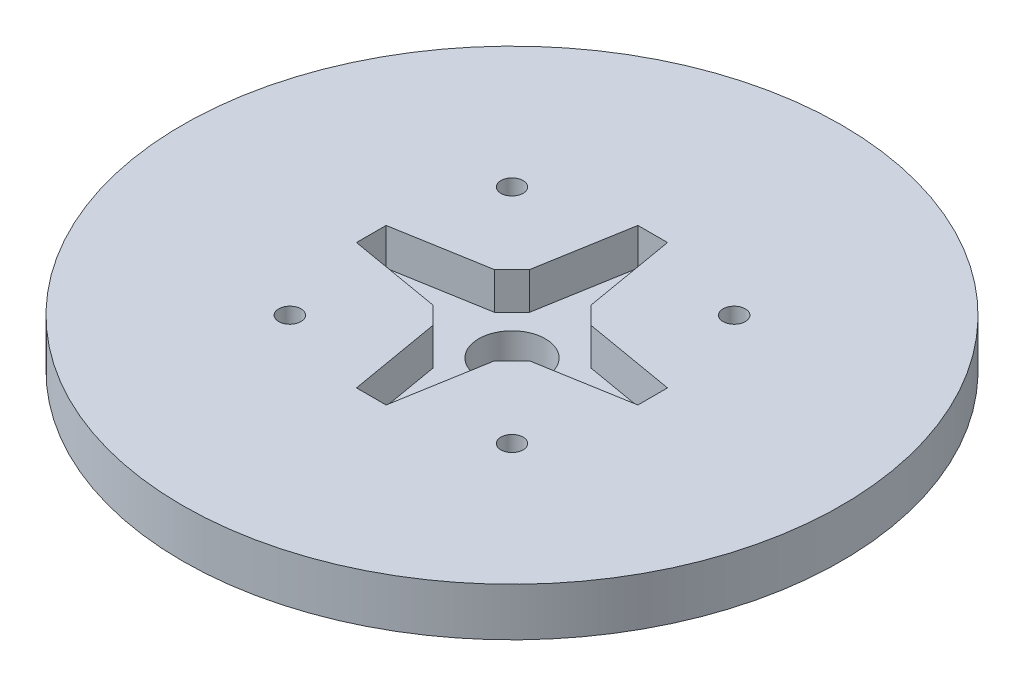
ISO-10303-21;
HEADER;
FILE_DESCRIPTION(('STEP AP214'),'2;1');
FILE_NAME('part.step','',(''),(''),'','','');
FILE_SCHEMA(('AUTOMOTIVE_DESIGN { 1 0 10303 214 1 1 1 1 }'));
ENDSEC;
DATA;
#1=APPLICATION_CONTEXT('core data for automotive mechanical design processes');
#2=APPLICATION_PROTOCOL_DEFINITION('international standard','automotive_design',2000,#1);
#3=PRODUCT_CONTEXT('',#1,'mechanical');
#4=PRODUCT('Part','Part','',(#3));
#5=PRODUCT_RELATED_PRODUCT_CATEGORY('part','',(#4));
#6=PRODUCT_DEFINITION_FORMATION('','',#4);
#7=PRODUCT_DEFINITION_CONTEXT('part definition',#1,'design');
#8=PRODUCT_DEFINITION('design','',#6,#7);
#9=PRODUCT_DEFINITION_SHAPE('','',#8);
#10=(LENGTH_UNIT() NAMED_UNIT(*) SI_UNIT(.MILLI.,.METRE.));
#11=(NAMED_UNIT(*) PLANE_ANGLE_UNIT() SI_UNIT($,.RADIAN.));
#12=(NAMED_UNIT(*) SI_UNIT($,.STERADIAN.) SOLID_ANGLE_UNIT());
#13=UNCERTAINTY_MEASURE_WITH_UNIT(LENGTH_MEASURE(1.E-05),#10,'distance_accuracy_value','');
#14=(GEOMETRIC_REPRESENTATION_CONTEXT(3) GLOBAL_UNCERTAINTY_ASSIGNED_CONTEXT((#13)) GLOBAL_UNIT_ASSIGNED_CONTEXT((#10,
#11,#12)) REPRESENTATION_CONTEXT('',''));
#15=CARTESIAN_POINT('',(0.,0.,0.));
#16=DIRECTION('',(0.,0.,1.));
#17=DIRECTION('',(1.,0.,0.));
#18=AXIS2_PLACEMENT_3D('',#15,#16,#17);
#19=CARTESIAN_POINT('',(0.,6.5,0.));
#20=DIRECTION('',(0.,-1.,0.));
#21=DIRECTION('',(0.,0.,-1.));
#22=AXIS2_PLACEMENT_3D('',#19,#20,#21);
#23=CYLINDRICAL_SURFACE('',#22,44.5);
#24=CARTESIAN_POINT('',(0.,6.5,0.));
#25=DIRECTION('',(0.,1.,0.));
#26=DIRECTION('',(0.,0.,1.));
#27=AXIS2_PLACEMENT_3D('',#24,#25,#26);
#28=CIRCLE('',#27,44.5);
#29=CARTESIAN_POINT('',(0.,6.5,-44.5));
#30=VERTEX_POINT('',#29);
#31=EDGE_CURVE('E11',#30,#30,#28,.T.);
#32=CARTESIAN_POINT('',(0.,0.,0.));
#33=DIRECTION('',(0.,1.,0.));
#34=DIRECTION('',(0.,0.,1.));
#35=AXIS2_PLACEMENT_3D('',#32,#33,#34);
#36=CIRCLE('',#35,44.5);
#37=CARTESIAN_POINT('',(0.,0.,-44.5));
#38=VERTEX_POINT('',#37);
#39=EDGE_CURVE('E48',#38,#38,#36,.T.);
#40=CARTESIAN_POINT('',(0.,6.5,-44.5));
#41=CARTESIAN_POINT('',(0.,6.43229166666667,-44.5));
#42=CARTESIAN_POINT('',(0.,6.36458333333333,-44.5));
#43=CARTESIAN_POINT('',(0.,6.22916666666667,-44.5));
#44=CARTESIAN_POINT('',(0.,6.16145833333333,-44.5));
#45=CARTESIAN_POINT('',(0.,6.02604166666667,-44.5));
#46=CARTESIAN_POINT('',(0.,5.95833333333333,-44.5));
#47=CARTESIAN_POINT('',(0.,5.82291666666667,-44.5));
#48=CARTESIAN_POINT('',(0.,5.75520833333333,-44.5));
#49=CARTESIAN_POINT('',(0.,5.61979166666667,-44.5));
#50=CARTESIAN_POINT('',(0.,5.55208333333333,-44.5));
#51=CARTESIAN_POINT('',(0.,5.41666666666667,-44.5));
#52=CARTESIAN_POINT('',(0.,5.34895833333333,-44.5));
#53=CARTESIAN_POINT('',(0.,5.21354166666667,-44.5));
#54=CARTESIAN_POINT('',(0.,5.14583333333333,-44.5));
#55=CARTESIAN_POINT('',(0.,5.01041666666667,-44.5));
#56=CARTESIAN_POINT('',(0.,4.94270833333333,-44.5));
#57=CARTESIAN_POINT('',(0.,4.80729166666667,-44.5));
#58=CARTESIAN_POINT('',(0.,4.73958333333333,-44.5));
#59=CARTESIAN_POINT('',(0.,4.60416666666667,-44.5));
#60=CARTESIAN_POINT('',(0.,4.53645833333333,-44.5));
#61=CARTESIAN_POINT('',(0.,4.40104166666667,-44.5));
#62=CARTESIAN_POINT('',(0.,4.33333333333333,-44.5));
#63=CARTESIAN_POINT('',(0.,4.19791666666667,-44.5));
#64=CARTESIAN_POINT('',(0.,4.13020833333333,-44.5));
#65=CARTESIAN_POINT('',(0.,3.99479166666667,-44.5));
#66=CARTESIAN_POINT('',(0.,3.92708333333333,-44.5));
#67=CARTESIAN_POINT('',(0.,3.79166666666667,-44.5));
#68=CARTESIAN_POINT('',(0.,3.72395833333333,-44.5));
#69=CARTESIAN_POINT('',(0.,3.58854166666667,-44.5));
#70=CARTESIAN_POINT('',(0.,3.52083333333333,-44.5));
#71=CARTESIAN_POINT('',(0.,3.38541666666667,-44.5));
#72=CARTESIAN_POINT('',(0.,3.31770833333333,-44.5));
#73=CARTESIAN_POINT('',(0.,3.18229166666667,-44.5));
#74=CARTESIAN_POINT('',(0.,3.11458333333333,-44.5));
#75=CARTESIAN_POINT('',(0.,2.97916666666667,-44.5));
#76=CARTESIAN_POINT('',(0.,2.91145833333333,-44.5));
#77=CARTESIAN_POINT('',(0.,2.77604166666667,-44.5));
#78=CARTESIAN_POINT('',(0.,2.70833333333333,-44.5));
#79=CARTESIAN_POINT('',(0.,2.57291666666667,-44.5));
#80=CARTESIAN_POINT('',(0.,2.50520833333333,-44.5));
#81=CARTESIAN_POINT('',(0.,2.36979166666667,-44.5));
#82=CARTESIAN_POINT('',(0.,2.30208333333333,-44.5));
#83=CARTESIAN_POINT('',(0.,2.16666666666667,-44.5));
#84=CARTESIAN_POINT('',(0.,2.09895833333333,-44.5));
#85=CARTESIAN_POINT('',(0.,1.96354166666667,-44.5));
#86=CARTESIAN_POINT('',(0.,1.89583333333333,-44.5));
#87=CARTESIAN_POINT('',(0.,1.76041666666667,-44.5));
#88=CARTESIAN_POINT('',(0.,1.69270833333333,-44.5));
#89=CARTESIAN_POINT('',(0.,1.55729166666667,-44.5));
#90=CARTESIAN_POINT('',(0.,1.48958333333333,-44.5));
#91=CARTESIAN_POINT('',(0.,1.35416666666667,-44.5));
#92=CARTESIAN_POINT('',(0.,1.28645833333333,-44.5));
#93=CARTESIAN_POINT('',(0.,1.15104166666667,-44.5));
#94=CARTESIAN_POINT('',(0.,1.08333333333333,-44.5));
#95=CARTESIAN_POINT('',(0.,0.947916666666667,-44.5));
#96=CARTESIAN_POINT('',(0.,0.880208333333333,-44.5));
#97=CARTESIAN_POINT('',(0.,0.744791666666667,-44.5));
#98=CARTESIAN_POINT('',(0.,0.677083333333333,-44.5));
#99=CARTESIAN_POINT('',(0.,0.541666666666667,-44.5));
#100=CARTESIAN_POINT('',(0.,0.473958333333333,-44.5));
#101=CARTESIAN_POINT('',(0.,0.338541666666667,-44.5));
#102=CARTESIAN_POINT('',(0.,0.270833333333334,-44.5));
#103=CARTESIAN_POINT('',(0.,0.135416666666667,-44.5));
#104=CARTESIAN_POINT('',(0.,0.0677083333333334,-44.5));
#105=CARTESIAN_POINT('',(0.,0.,-44.5));
#106=B_SPLINE_CURVE_WITH_KNOTS('',3,(#40,#41,#42,#43,#44,#45,#46,#47,#48,#49,#50,#51,#52,#53,
#54,#55,#56,#57,#58,#59,#60,#61,#62,#63,#64,#65,#66,#67,#68,#69,#70,#71,#72,#73,#74,#75,#76,#77,
#78,#79,#80,#81,#82,#83,#84,#85,#86,#87,#88,#89,#90,#91,#92,#93,#94,#95,#96,#97,#98,#99,#100,
#101,#102,#103,#104,#105),.UNSPECIFIED.,.F.,.F.,(4,2,2,2,2,2,2,2,2,2,2,2,2,2,2,2,2,2,2,2,2,2,2,
2,2,2,2,2,2,2,2,2,4),(0.,0.203125,0.40625,0.609375000000001,0.812500000000001,1.015625,1.21875,
1.421875,1.625,1.828125,2.03125,2.234375,2.4375,2.640625,2.84375,3.046875,3.25,3.453125,3.65625,
3.859375,4.0625,4.265625,4.46875,4.671875,4.875,5.078125,5.28125,5.484375,5.6875,5.890625,
6.09375,6.296875,6.5),.UNSPECIFIED.);
#107=EDGE_CURVE('BSEAM39',#30,#38,#106,.T.);
#108=ORIENTED_EDGE('',*,*,#31,.F.);
#109=ORIENTED_EDGE('',*,*,#39,.T.);
#110=ORIENTED_EDGE('',*,*,#107,.T.);
#111=ORIENTED_EDGE('',*,*,#107,.F.);
#112=EDGE_LOOP('',(#108,#110,#109,#111));
#113=FACE_BOUND('',#112,.T.);
#114=ADVANCED_FACE('F39',(#113),#23,.T.);
#115=CARTESIAN_POINT('',(0.,6.5,0.));
#116=DIRECTION('',(0.,1.,0.));
#117=DIRECTION('',(0.,0.,1.));
#118=AXIS2_PLACEMENT_3D('',#115,#116,#117);
#119=PLANE('',#118);
#120=DIRECTION('',(-0.707106781186547,0.,0.707106781186548));
#121=VECTOR('',#120,1.);
#122=CARTESIAN_POINT('',(-6.5,6.5,-4.1551724137931));
#123=LINE('',#122,#121);
#124=CARTESIAN_POINT('',(-4.15517241379311,6.5,-6.5));
#125=VERTEX_POINT('',#124);
#126=CARTESIAN_POINT('',(-6.5,6.5,-4.1551724137931));
#127=VERTEX_POINT('',#126);
#128=EDGE_CURVE('E504',#125,#127,#123,.T.);
#129=ORIENTED_EDGE('',*,*,#128,.F.);
#130=DIRECTION('',(-0.169906916507646,0.,0.985460115744348));
#131=VECTOR('',#130,1.);
#132=CARTESIAN_POINT('',(-2.,6.5,-19.));
#133=LINE('',#132,#131);
#134=CARTESIAN_POINT('',(-2.,6.5,-19.));
#135=VERTEX_POINT('',#134);
#136=EDGE_CURVE('E176',#135,#125,#133,.T.);
#137=ORIENTED_EDGE('',*,*,#136,.F.);
#138=DIRECTION('',(-1.,0.,0.));
#139=VECTOR('',#138,1.);
#140=CARTESIAN_POINT('',(-2.,6.5,-19.));
#141=LINE('',#140,#139);
#142=CARTESIAN_POINT('',(2.,6.5,-19.));
#143=VERTEX_POINT('',#142);
#144=EDGE_CURVE('E172',#143,#135,#141,.T.);
#145=ORIENTED_EDGE('',*,*,#144,.F.);
#146=DIRECTION('',(-0.169906916507646,0.,-0.985460115744348));
#147=VECTOR('',#146,1.);
#148=CARTESIAN_POINT('',(2.,6.5,-19.));
#149=LINE('',#148,#147);
#150=CARTESIAN_POINT('',(4.15517241379311,6.5,-6.49999999999999));
#151=VERTEX_POINT('',#150);
#152=EDGE_CURVE('E56',#151,#143,#149,.T.);
#153=ORIENTED_EDGE('',*,*,#152,.F.);
#154=DIRECTION('',(-0.707106781186547,0.,-0.707106781186548));
#155=VECTOR('',#154,1.);
#156=CARTESIAN_POINT('',(6.5,6.5,-4.1551724137931));
#157=LINE('',#156,#155);
#158=CARTESIAN_POINT('',(6.5,6.5,-4.1551724137931));
#159=VERTEX_POINT('',#158);
#160=EDGE_CURVE('E403',#159,#151,#157,.T.);
#161=ORIENTED_EDGE('',*,*,#160,.F.);
#162=DIRECTION('',(-0.985460115744348,0.,-0.169906916507646));
#163=VECTOR('',#162,1.);
#164=CARTESIAN_POINT('',(4.5,6.5,-4.5));
#165=LINE('',#164,#163);
#166=CARTESIAN_POINT('',(19.,6.5,-2.));
#167=VERTEX_POINT('',#166);
#168=EDGE_CURVE('E205',#167,#159,#165,.T.);
#169=ORIENTED_EDGE('',*,*,#168,.F.);
#170=DIRECTION('',(0.,0.,-1.));
#171=VECTOR('',#170,1.);
#172=CARTESIAN_POINT('',(19.,6.5,-2.));
#173=LINE('',#172,#171);
#174=CARTESIAN_POINT('',(19.,6.5,2.));
#175=VERTEX_POINT('',#174);
#176=EDGE_CURVE('E202',#175,#167,#173,.T.);
#177=ORIENTED_EDGE('',*,*,#176,.F.);
#178=DIRECTION('',(0.985460115744348,0.,-0.169906916507646));
#179=VECTOR('',#178,1.);
#180=CARTESIAN_POINT('',(4.5,6.5,4.5));
#181=LINE('',#180,#179);
#182=CARTESIAN_POINT('',(6.5,6.5,4.15517241379311));
#183=VERTEX_POINT('',#182);
#184=EDGE_CURVE('E199',#183,#175,#181,.T.);
#185=ORIENTED_EDGE('',*,*,#184,.F.);
#186=DIRECTION('',(0.707106781186548,0.,-0.707106781186548));
#187=VECTOR('',#186,1.);
#188=CARTESIAN_POINT('',(6.5,6.5,4.15517241379311));
#189=LINE('',#188,#187);
#190=CARTESIAN_POINT('',(4.1551724137931,6.5,6.5));
#191=VERTEX_POINT('',#190);
#192=EDGE_CURVE('E413',#191,#183,#189,.T.);
#193=ORIENTED_EDGE('',*,*,#192,.F.);
#194=DIRECTION('',(0.169906916507646,0.,-0.985460115744348));
#195=VECTOR('',#194,1.);
#196=CARTESIAN_POINT('',(2.,6.5,19.));
#197=LINE('',#196,#195);
#198=CARTESIAN_POINT('',(2.,6.5,19.));
#199=VERTEX_POINT('',#198);
#200=EDGE_CURVE('E196',#199,#191,#197,.T.);
#201=ORIENTED_EDGE('',*,*,#200,.F.);
#202=DIRECTION('',(1.,0.,0.));
#203=VECTOR('',#202,1.);
#204=CARTESIAN_POINT('',(-2.,6.5,19.));
#205=LINE('',#204,#203);
#206=CARTESIAN_POINT('',(-2.,6.5,19.));
#207=VERTEX_POINT('',#206);
#208=EDGE_CURVE('E128',#207,#199,#205,.T.);
#209=ORIENTED_EDGE('',*,*,#208,.F.);
#210=DIRECTION('',(0.169906916507646,0.,0.985460115744348));
#211=VECTOR('',#210,1.);
#212=CARTESIAN_POINT('',(-2.,6.5,19.));
#213=LINE('',#212,#211);
#214=CARTESIAN_POINT('',(-4.15517241379311,6.5,6.5));
#215=VERTEX_POINT('',#214);
#216=EDGE_CURVE('E191',#215,#207,#213,.T.);
#217=ORIENTED_EDGE('',*,*,#216,.F.);
#218=DIRECTION('',(0.707106781186547,0.,0.707106781186548));
#219=VECTOR('',#218,1.);
#220=CARTESIAN_POINT('',(-6.5,6.5,4.1551724137931));
#221=LINE('',#220,#219);
#222=CARTESIAN_POINT('',(-6.5,6.5,4.1551724137931));
#223=VERTEX_POINT('',#222);
#224=EDGE_CURVE('E502',#223,#215,#221,.T.);
#225=ORIENTED_EDGE('',*,*,#224,.F.);
#226=DIRECTION('',(0.985460115744348,0.,0.169906916507646));
#227=VECTOR('',#226,1.);
#228=CARTESIAN_POINT('',(-4.5,6.5,4.5));
#229=LINE('',#228,#227);
#230=CARTESIAN_POINT('',(-19.,6.5,2.));
#231=VERTEX_POINT('',#230);
#232=EDGE_CURVE('E187',#231,#223,#229,.T.);
#233=ORIENTED_EDGE('',*,*,#232,.F.);
#234=DIRECTION('',(0.,0.,1.));
#235=VECTOR('',#234,1.);
#236=CARTESIAN_POINT('',(-19.,6.5,-2.));
#237=LINE('',#236,#235);
#238=CARTESIAN_POINT('',(-19.,6.5,-2.));
#239=VERTEX_POINT('',#238);
#240=EDGE_CURVE('E183',#239,#231,#237,.T.);
#241=ORIENTED_EDGE('',*,*,#240,.F.);
#242=DIRECTION('',(-0.985460115744348,0.,0.169906916507646));
#243=VECTOR('',#242,1.);
#244=CARTESIAN_POINT('',(-4.5,6.5,-4.5));
#245=LINE('',#244,#243);
#246=EDGE_CURVE('E180',#127,#239,#245,.T.);
#247=ORIENTED_EDGE('',*,*,#246,.F.);
#248=EDGE_LOOP('',(#129,#137,#145,#153,#161,#169,#177,#185,#193,#201,#209,#217,#225,#233,#241,#247));
#249=FACE_BOUND('',#248,.T.);
#250=CARTESIAN_POINT('',(-15.,6.5,15.));
#251=DIRECTION('',(0.,1.,0.));
#252=DIRECTION('',(0.,0.,1.));
#253=AXIS2_PLACEMENT_3D('',#250,#251,#252);
#254=CIRCLE('',#253,1.5);
#255=CARTESIAN_POINT('',(-15.,6.5,16.5));
#256=VERTEX_POINT('',#255);
#257=EDGE_CURVE('E243',#256,#256,#254,.T.);
#258=ORIENTED_EDGE('',*,*,#257,.F.);
#259=EDGE_LOOP('',(#258));
#260=FACE_BOUND('',#259,.T.);
#261=CARTESIAN_POINT('',(15.,6.5,15.));
#262=DIRECTION('',(0.,1.,0.));
#263=DIRECTION('',(0.,0.,1.));
#264=AXIS2_PLACEMENT_3D('',#261,#262,#263);
#265=CIRCLE('',#264,1.5);
#266=CARTESIAN_POINT('',(15.,6.5,16.5));
#267=VERTEX_POINT('',#266);
#268=EDGE_CURVE('E238',#267,#267,#265,.T.);
#269=ORIENTED_EDGE('',*,*,#268,.F.);
#270=EDGE_LOOP('',(#269));
#271=FACE_BOUND('',#270,.T.);
#272=CARTESIAN_POINT('',(15.,6.5,-15.));
#273=DIRECTION('',(0.,1.,0.));
#274=DIRECTION('',(0.,0.,1.));
#275=AXIS2_PLACEMENT_3D('',#272,#273,#274);
#276=CIRCLE('',#275,1.5);
#277=CARTESIAN_POINT('',(15.,6.5,-13.5));
#278=VERTEX_POINT('',#277);
#279=EDGE_CURVE('E233',#278,#278,#276,.T.);
#280=ORIENTED_EDGE('',*,*,#279,.F.);
#281=EDGE_LOOP('',(#280));
#282=FACE_BOUND('',#281,.T.);
#283=CARTESIAN_POINT('',(-15.,6.5,-15.));
#284=DIRECTION('',(0.,1.,0.));
#285=DIRECTION('',(0.,0.,1.));
#286=AXIS2_PLACEMENT_3D('',#283,#284,#285);
#287=CIRCLE('',#286,1.5);
#288=CARTESIAN_POINT('',(-15.,6.5,-13.5));
#289=VERTEX_POINT('',#288);
#290=EDGE_CURVE('E228',#289,#289,#287,.T.);
#291=ORIENTED_EDGE('',*,*,#290,.F.);
#292=EDGE_LOOP('',(#291));
#293=FACE_BOUND('',#292,.T.);
#294=ORIENTED_EDGE('',*,*,#31,.T.);
#295=EDGE_LOOP('',(#294));
#296=FACE_BOUND('',#295,.T.);
#297=ADVANCED_FACE('F290',(#249,#260,#271,#282,#293,#296),#119,.T.);
#298=CARTESIAN_POINT('',(0.,0.,0.));
#299=DIRECTION('',(0.,1.,0.));
#300=DIRECTION('',(0.,0.,1.));
#301=AXIS2_PLACEMENT_3D('',#298,#299,#300);
#302=PLANE('',#301);
#303=CARTESIAN_POINT('',(0.,0.,0.));
#304=DIRECTION('',(0.,1.,0.));
#305=DIRECTION('',(0.,0.,1.));
#306=AXIS2_PLACEMENT_3D('',#303,#304,#305);
#307=CIRCLE('',#306,32.5);
#308=CARTESIAN_POINT('',(0.,0.,32.5));
#309=VERTEX_POINT('',#308);
#310=EDGE_CURVE('E247',#309,#309,#307,.T.);
#311=ORIENTED_EDGE('',*,*,#310,.T.);
#312=EDGE_LOOP('',(#311));
#313=FACE_BOUND('',#312,.T.);
#314=ORIENTED_EDGE('',*,*,#39,.F.);
#315=EDGE_LOOP('',(#314));
#316=FACE_BOUND('',#315,.T.);
#317=ADVANCED_FACE('F295',(#313,#316),#302,.F.);
#318=CARTESIAN_POINT('',(0.,-8.,0.));
#319=DIRECTION('',(0.,1.,0.));
#320=DIRECTION('',(0.,0.,1.));
#321=AXIS2_PLACEMENT_3D('',#318,#319,#320);
#322=CYLINDRICAL_SURFACE('',#321,32.5);
#323=CARTESIAN_POINT('',(0.,-8.,0.));
#324=DIRECTION('',(0.,1.,0.));
#325=DIRECTION('',(0.,0.,1.));
#326=AXIS2_PLACEMENT_3D('',#323,#324,#325);
#327=CIRCLE('',#326,32.5);
#328=CARTESIAN_POINT('',(0.,-8.,32.5));
#329=VERTEX_POINT('',#328);
#330=EDGE_CURVE('E248',#329,#329,#327,.T.);
#331=ORIENTED_EDGE('',*,*,#330,.T.);
#332=EDGE_LOOP('',(#331));
#333=FACE_BOUND('',#332,.T.);
#334=ORIENTED_EDGE('',*,*,#310,.F.);
#335=EDGE_LOOP('',(#334));
#336=FACE_BOUND('',#335,.T.);
#337=ADVANCED_FACE('F303',(#333,#336),#322,.T.);
#338=CARTESIAN_POINT('',(0.,-8.,0.));
#339=DIRECTION('',(0.,1.,0.));
#340=DIRECTION('',(0.,0.,1.));
#341=AXIS2_PLACEMENT_3D('',#338,#339,#340);
#342=PLANE('',#341);
#343=CARTESIAN_POINT('',(-15.,-8.,15.));
#344=DIRECTION('',(0.,1.,0.));
#345=DIRECTION('',(0.,0.,1.));
#346=AXIS2_PLACEMENT_3D('',#343,#344,#345);
#347=CIRCLE('',#346,1.5);
#348=CARTESIAN_POINT('',(-15.,-8.,16.5));
#349=VERTEX_POINT('',#348);
#350=EDGE_CURVE('E242',#349,#349,#347,.T.);
#351=ORIENTED_EDGE('',*,*,#350,.T.);
#352=EDGE_LOOP('',(#351));
#353=FACE_BOUND('',#352,.T.);
#354=CARTESIAN_POINT('',(15.,-8.,15.));
#355=DIRECTION('',(0.,1.,0.));
#356=DIRECTION('',(0.,0.,1.));
#357=AXIS2_PLACEMENT_3D('',#354,#355,#356);
#358=CIRCLE('',#357,1.5);
#359=CARTESIAN_POINT('',(15.,-8.,16.5));
#360=VERTEX_POINT('',#359);
#361=EDGE_CURVE('E237',#360,#360,#358,.T.);
#362=ORIENTED_EDGE('',*,*,#361,.T.);
#363=EDGE_LOOP('',(#362));
#364=FACE_BOUND('',#363,.T.);
#365=CARTESIAN_POINT('',(15.,-8.,-15.));
#366=DIRECTION('',(0.,1.,0.));
#367=DIRECTION('',(0.,0.,1.));
#368=AXIS2_PLACEMENT_3D('',#365,#366,#367);
#369=CIRCLE('',#368,1.5);
#370=CARTESIAN_POINT('',(15.,-8.,-13.5));
#371=VERTEX_POINT('',#370);
#372=EDGE_CURVE('E232',#371,#371,#369,.T.);
#373=ORIENTED_EDGE('',*,*,#372,.T.);
#374=EDGE_LOOP('',(#373));
#375=FACE_BOUND('',#374,.T.);
#376=CARTESIAN_POINT('',(-15.,-8.,-15.));
#377=DIRECTION('',(0.,1.,0.));
#378=DIRECTION('',(0.,0.,1.));
#379=AXIS2_PLACEMENT_3D('',#376,#377,#378);
#380=CIRCLE('',#379,1.5);
#381=CARTESIAN_POINT('',(-15.,-8.,-13.5));
#382=VERTEX_POINT('',#381);
#383=EDGE_CURVE('E210',#382,#382,#380,.T.);
#384=ORIENTED_EDGE('',*,*,#383,.T.);
#385=EDGE_LOOP('',(#384));
#386=FACE_BOUND('',#385,.T.);
#387=ORIENTED_EDGE('',*,*,#330,.F.);
#388=EDGE_LOOP('',(#387));
#389=FACE_BOUND('',#388,.T.);
#390=ADVANCED_FACE('F270',(#353,#364,#375,#386,#389),#342,.F.);
#391=CARTESIAN_POINT('',(-15.,-30.,-15.));
#392=DIRECTION('',(0.,1.,0.));
#393=DIRECTION('',(0.,0.,1.));
#394=AXIS2_PLACEMENT_3D('',#391,#392,#393);
#395=CYLINDRICAL_SURFACE('',#394,1.5);
#396=ORIENTED_EDGE('',*,*,#290,.T.);
#397=EDGE_LOOP('',(#396));
#398=FACE_BOUND('',#397,.T.);
#399=ORIENTED_EDGE('',*,*,#383,.F.);
#400=EDGE_LOOP('',(#399));
#401=FACE_BOUND('',#400,.T.);
#402=ADVANCED_FACE('F312',(#398,#401),#395,.F.);
#403=CARTESIAN_POINT('',(15.,-30.,-15.));
#404=DIRECTION('',(0.,1.,0.));
#405=DIRECTION('',(0.,0.,1.));
#406=AXIS2_PLACEMENT_3D('',#403,#404,#405);
#407=CYLINDRICAL_SURFACE('',#406,1.5);
#408=ORIENTED_EDGE('',*,*,#279,.T.);
#409=EDGE_LOOP('',(#408));
#410=FACE_BOUND('',#409,.T.);
#411=ORIENTED_EDGE('',*,*,#372,.F.);
#412=EDGE_LOOP('',(#411));
#413=FACE_BOUND('',#412,.T.);
#414=ADVANCED_FACE('F285',(#410,#413),#407,.F.);
#415=CARTESIAN_POINT('',(15.,-30.,15.));
#416=DIRECTION('',(0.,1.,0.));
#417=DIRECTION('',(0.,0.,1.));
#418=AXIS2_PLACEMENT_3D('',#415,#416,#417);
#419=CYLINDRICAL_SURFACE('',#418,1.5);
#420=ORIENTED_EDGE('',*,*,#268,.T.);
#421=EDGE_LOOP('',(#420));
#422=FACE_BOUND('',#421,.T.);
#423=ORIENTED_EDGE('',*,*,#361,.F.);
#424=EDGE_LOOP('',(#423));
#425=FACE_BOUND('',#424,.T.);
#426=ADVANCED_FACE('F276',(#422,#425),#419,.F.);
#427=CARTESIAN_POINT('',(-15.,-30.,15.));
#428=DIRECTION('',(0.,1.,0.));
#429=DIRECTION('',(0.,0.,1.));
#430=AXIS2_PLACEMENT_3D('',#427,#428,#429);
#431=CYLINDRICAL_SURFACE('',#430,1.5);
#432=ORIENTED_EDGE('',*,*,#257,.T.);
#433=EDGE_LOOP('',(#432));
#434=FACE_BOUND('',#433,.T.);
#435=ORIENTED_EDGE('',*,*,#350,.F.);
#436=EDGE_LOOP('',(#435));
#437=FACE_BOUND('',#436,.T.);
#438=ADVANCED_FACE('F273',(#434,#437),#431,.F.);
#439=CARTESIAN_POINT('',(2.,1.5,-19.));
#440=DIRECTION('',(0.985460115744348,0.,-0.169906916507646));
#441=DIRECTION('',(-0.169906916507646,0.,-0.985460115744348));
#442=AXIS2_PLACEMENT_3D('',#439,#440,#441);
#443=PLANE('',#442);
#444=DIRECTION('',(-0.169906916507646,0.,-0.985460115744348));
#445=VECTOR('',#444,1.);
#446=CARTESIAN_POINT('',(2.,1.5,-19.));
#447=LINE('',#446,#445);
#448=CARTESIAN_POINT('',(4.15517241379311,1.5,-6.49999999999999));
#449=VERTEX_POINT('',#448);
#450=CARTESIAN_POINT('',(2.,1.5,-19.));
#451=VERTEX_POINT('',#450);
#452=EDGE_CURVE('E102',#449,#451,#447,.T.);
#453=ORIENTED_EDGE('',*,*,#452,.F.);
#454=DIRECTION('',(0.,1.,0.));
#455=VECTOR('',#454,1.);
#456=CARTESIAN_POINT('',(4.15517241379311,1.5,-6.49999999999999));
#457=LINE('',#456,#455);
#458=EDGE_CURVE('E406',#449,#151,#457,.T.);
#459=ORIENTED_EDGE('',*,*,#458,.T.);
#460=ORIENTED_EDGE('',*,*,#152,.T.);
#461=DIRECTION('',(0.,1.,0.));
#462=VECTOR('',#461,1.);
#463=CARTESIAN_POINT('',(2.,1.5,-19.));
#464=LINE('',#463,#462);
#465=EDGE_CURVE('E169',#451,#143,#464,.T.);
#466=ORIENTED_EDGE('',*,*,#465,.F.);
#467=EDGE_LOOP('',(#453,#459,#460,#466));
#468=FACE_BOUND('',#467,.T.);
#469=ADVANCED_FACE('F275',(#468),#443,.F.);
#470=CARTESIAN_POINT('',(4.5,1.5,-4.5));
#471=DIRECTION('',(0.169906916507646,0.,-0.985460115744348));
#472=DIRECTION('',(-0.985460115744348,0.,-0.169906916507646));
#473=AXIS2_PLACEMENT_3D('',#470,#471,#472);
#474=PLANE('',#473);
#475=ORIENTED_EDGE('',*,*,#168,.T.);
#476=DIRECTION('',(0.,1.,0.));
#477=VECTOR('',#476,1.);
#478=CARTESIAN_POINT('',(6.5,1.5,-4.1551724137931));
#479=LINE('',#478,#477);
#480=CARTESIAN_POINT('',(6.5,1.5,-4.1551724137931));
#481=VERTEX_POINT('',#480);
#482=EDGE_CURVE('E409',#481,#159,#479,.T.);
#483=ORIENTED_EDGE('',*,*,#482,.F.);
#484=DIRECTION('',(-0.985460115744348,0.,-0.169906916507646));
#485=VECTOR('',#484,1.);
#486=CARTESIAN_POINT('',(4.5,1.5,-4.5));
#487=LINE('',#486,#485);
#488=CARTESIAN_POINT('',(19.,1.5,-2.));
#489=VERTEX_POINT('',#488);
#490=EDGE_CURVE('E165',#489,#481,#487,.T.);
#491=ORIENTED_EDGE('',*,*,#490,.F.);
#492=DIRECTION('',(0.,1.,0.));
#493=VECTOR('',#492,1.);
#494=CARTESIAN_POINT('',(19.,1.5,-2.));
#495=LINE('',#494,#493);
#496=EDGE_CURVE('E65',#489,#167,#495,.T.);
#497=ORIENTED_EDGE('',*,*,#496,.T.);
#498=EDGE_LOOP('',(#475,#483,#491,#497));
#499=FACE_BOUND('',#498,.T.);
#500=ADVANCED_FACE('F283',(#499),#474,.F.);
#501=CARTESIAN_POINT('',(19.,1.5,-2.));
#502=DIRECTION('',(1.,0.,0.));
#503=DIRECTION('',(0.,0.,-1.));
#504=AXIS2_PLACEMENT_3D('',#501,#502,#503);
#505=PLANE('',#504);
#506=ORIENTED_EDGE('',*,*,#176,.T.);
#507=ORIENTED_EDGE('',*,*,#496,.F.);
#508=DIRECTION('',(0.,0.,-1.));
#509=VECTOR('',#508,1.);
#510=CARTESIAN_POINT('',(19.,1.5,-2.));
#511=LINE('',#510,#509);
#512=CARTESIAN_POINT('',(19.,1.5,2.));
#513=VERTEX_POINT('',#512);
#514=EDGE_CURVE('E162',#513,#489,#511,.T.);
#515=ORIENTED_EDGE('',*,*,#514,.F.);
#516=DIRECTION('',(0.,1.,0.));
#517=VECTOR('',#516,1.);
#518=CARTESIAN_POINT('',(19.,1.5,2.));
#519=LINE('',#518,#517);
#520=EDGE_CURVE('E133',#513,#175,#519,.T.);
#521=ORIENTED_EDGE('',*,*,#520,.T.);
#522=EDGE_LOOP('',(#506,#507,#515,#521));
#523=FACE_BOUND('',#522,.T.);
#524=ADVANCED_FACE('F365',(#523),#505,.F.);
#525=CARTESIAN_POINT('',(4.5,1.5,4.5));
#526=DIRECTION('',(0.169906916507646,0.,0.985460115744348));
#527=DIRECTION('',(0.985460115744348,0.,-0.169906916507646));
#528=AXIS2_PLACEMENT_3D('',#525,#526,#527);
#529=PLANE('',#528);
#530=DIRECTION('',(0.985460115744348,0.,-0.169906916507646));
#531=VECTOR('',#530,1.);
#532=CARTESIAN_POINT('',(4.5,1.5,4.5));
#533=LINE('',#532,#531);
#534=CARTESIAN_POINT('',(6.5,1.5,4.15517241379311));
#535=VERTEX_POINT('',#534);
#536=EDGE_CURVE('E145',#535,#513,#533,.T.);
#537=ORIENTED_EDGE('',*,*,#536,.F.);
#538=DIRECTION('',(0.,1.,0.));
#539=VECTOR('',#538,1.);
#540=CARTESIAN_POINT('',(6.5,1.5,4.15517241379311));
#541=LINE('',#540,#539);
#542=EDGE_CURVE('E486',#535,#183,#541,.T.);
#543=ORIENTED_EDGE('',*,*,#542,.T.);
#544=ORIENTED_EDGE('',*,*,#184,.T.);
#545=ORIENTED_EDGE('',*,*,#520,.F.);
#546=EDGE_LOOP('',(#537,#543,#544,#545));
#547=FACE_BOUND('',#546,.T.);
#548=ADVANCED_FACE('F362',(#547),#529,.F.);
#549=CARTESIAN_POINT('',(2.,1.5,19.));
#550=DIRECTION('',(0.985460115744348,0.,0.169906916507646));
#551=DIRECTION('',(0.169906916507646,0.,-0.985460115744348));
#552=AXIS2_PLACEMENT_3D('',#549,#550,#551);
#553=PLANE('',#552);
#554=ORIENTED_EDGE('',*,*,#200,.T.);
#555=DIRECTION('',(0.,1.,0.));
#556=VECTOR('',#555,1.);
#557=CARTESIAN_POINT('',(4.1551724137931,1.5,6.5));
#558=LINE('',#557,#556);
#559=CARTESIAN_POINT('',(4.1551724137931,1.5,6.5));
#560=VERTEX_POINT('',#559);
#561=EDGE_CURVE('E142',#560,#191,#558,.T.);
#562=ORIENTED_EDGE('',*,*,#561,.F.);
#563=DIRECTION('',(0.169906916507646,0.,-0.985460115744348));
#564=VECTOR('',#563,1.);
#565=CARTESIAN_POINT('',(2.,1.5,19.));
#566=LINE('',#565,#564);
#567=CARTESIAN_POINT('',(2.,1.5,19.));
#568=VERTEX_POINT('',#567);
#569=EDGE_CURVE('E138',#568,#560,#566,.T.);
#570=ORIENTED_EDGE('',*,*,#569,.F.);
#571=DIRECTION('',(0.,1.,0.));
#572=VECTOR('',#571,1.);
#573=CARTESIAN_POINT('',(2.,1.5,19.));
#574=LINE('',#573,#572);
#575=EDGE_CURVE('E121',#568,#199,#574,.T.);
#576=ORIENTED_EDGE('',*,*,#575,.T.);
#577=EDGE_LOOP('',(#554,#562,#570,#576));
#578=FACE_BOUND('',#577,.T.);
#579=ADVANCED_FACE('F139',(#578),#553,.F.);
#580=CARTESIAN_POINT('',(-2.,1.5,19.));
#581=DIRECTION('',(0.,0.,1.));
#582=DIRECTION('',(1.,0.,0.));
#583=AXIS2_PLACEMENT_3D('',#580,#581,#582);
#584=PLANE('',#583);
#585=ORIENTED_EDGE('',*,*,#208,.T.);
#586=ORIENTED_EDGE('',*,*,#575,.F.);
#587=DIRECTION('',(1.,0.,0.));
#588=VECTOR('',#587,1.);
#589=CARTESIAN_POINT('',(-2.,1.5,19.));
#590=LINE('',#589,#588);
#591=CARTESIAN_POINT('',(-2.,1.5,19.));
#592=VERTEX_POINT('',#591);
#593=EDGE_CURVE('E126',#592,#568,#590,.T.);
#594=ORIENTED_EDGE('',*,*,#593,.F.);
#595=DIRECTION('',(0.,1.,0.));
#596=VECTOR('',#595,1.);
#597=CARTESIAN_POINT('',(-2.,1.5,19.));
#598=LINE('',#597,#596);
#599=EDGE_CURVE('E134',#592,#207,#598,.T.);
#600=ORIENTED_EDGE('',*,*,#599,.T.);
#601=EDGE_LOOP('',(#585,#586,#594,#600));
#602=FACE_BOUND('',#601,.T.);
#603=ADVANCED_FACE('F123',(#602),#584,.F.);
#604=CARTESIAN_POINT('',(-2.,1.5,19.));
#605=DIRECTION('',(-0.985460115744348,0.,0.169906916507646));
#606=DIRECTION('',(0.169906916507646,0.,0.985460115744348));
#607=AXIS2_PLACEMENT_3D('',#604,#605,#606);
#608=PLANE('',#607);
#609=DIRECTION('',(0.169906916507646,0.,0.985460115744348));
#610=VECTOR('',#609,1.);
#611=CARTESIAN_POINT('',(-2.,1.5,19.));
#612=LINE('',#611,#610);
#613=CARTESIAN_POINT('',(-4.15517241379311,1.5,6.5));
#614=VERTEX_POINT('',#613);
#615=EDGE_CURVE('E151',#614,#592,#612,.T.);
#616=ORIENTED_EDGE('',*,*,#615,.F.);
#617=DIRECTION('',(0.,1.,0.));
#618=VECTOR('',#617,1.);
#619=CARTESIAN_POINT('',(-4.15517241379311,1.5,6.5));
#620=LINE('',#619,#618);
#621=EDGE_CURVE('E459',#614,#215,#620,.T.);
#622=ORIENTED_EDGE('',*,*,#621,.T.);
#623=ORIENTED_EDGE('',*,*,#216,.T.);
#624=ORIENTED_EDGE('',*,*,#599,.F.);
#625=EDGE_LOOP('',(#616,#622,#623,#624));
#626=FACE_BOUND('',#625,.T.);
#627=ADVANCED_FACE('F353',(#626),#608,.F.);
#628=CARTESIAN_POINT('',(-4.5,1.5,4.5));
#629=DIRECTION('',(-0.169906916507646,0.,0.985460115744348));
#630=DIRECTION('',(0.985460115744348,0.,0.169906916507646));
#631=AXIS2_PLACEMENT_3D('',#628,#629,#630);
#632=PLANE('',#631);
#633=ORIENTED_EDGE('',*,*,#232,.T.);
#634=DIRECTION('',(0.,1.,0.));
#635=VECTOR('',#634,1.);
#636=CARTESIAN_POINT('',(-6.5,1.5,4.1551724137931));
#637=LINE('',#636,#635);
#638=CARTESIAN_POINT('',(-6.5,1.5,4.1551724137931));
#639=VERTEX_POINT('',#638);
#640=EDGE_CURVE('E453',#639,#223,#637,.T.);
#641=ORIENTED_EDGE('',*,*,#640,.F.);
#642=DIRECTION('',(0.985460115744348,0.,0.169906916507646));
#643=VECTOR('',#642,1.);
#644=CARTESIAN_POINT('',(-4.5,1.5,4.5));
#645=LINE('',#644,#643);
#646=CARTESIAN_POINT('',(-19.,1.5,2.));
#647=VERTEX_POINT('',#646);
#648=EDGE_CURVE('E156',#647,#639,#645,.T.);
#649=ORIENTED_EDGE('',*,*,#648,.F.);
#650=DIRECTION('',(0.,1.,0.));
#651=VECTOR('',#650,1.);
#652=CARTESIAN_POINT('',(-19.,1.5,2.));
#653=LINE('',#652,#651);
#654=EDGE_CURVE('E216',#647,#231,#653,.T.);
#655=ORIENTED_EDGE('',*,*,#654,.T.);
#656=EDGE_LOOP('',(#633,#641,#649,#655));
#657=FACE_BOUND('',#656,.T.);
#658=ADVANCED_FACE('F349',(#657),#632,.F.);
#659=CARTESIAN_POINT('',(-19.,1.5,-2.));
#660=DIRECTION('',(-1.,0.,0.));
#661=DIRECTION('',(0.,0.,1.));
#662=AXIS2_PLACEMENT_3D('',#659,#660,#661);
#663=PLANE('',#662);
#664=ORIENTED_EDGE('',*,*,#240,.T.);
#665=ORIENTED_EDGE('',*,*,#654,.F.);
#666=DIRECTION('',(0.,0.,1.));
#667=VECTOR('',#666,1.);
#668=CARTESIAN_POINT('',(-19.,1.5,-2.));
#669=LINE('',#668,#667);
#670=CARTESIAN_POINT('',(-19.,1.5,-2.));
#671=VERTEX_POINT('',#670);
#672=EDGE_CURVE('E438',#671,#647,#669,.T.);
#673=ORIENTED_EDGE('',*,*,#672,.F.);
#674=DIRECTION('',(0.,1.,0.));
#675=VECTOR('',#674,1.);
#676=CARTESIAN_POINT('',(-19.,1.5,-2.));
#677=LINE('',#676,#675);
#678=EDGE_CURVE('E219',#671,#239,#677,.T.);
#679=ORIENTED_EDGE('',*,*,#678,.T.);
#680=EDGE_LOOP('',(#664,#665,#673,#679));
#681=FACE_BOUND('',#680,.T.);
#682=ADVANCED_FACE('F345',(#681),#663,.F.);
#683=CARTESIAN_POINT('',(-4.5,1.5,-4.5));
#684=DIRECTION('',(-0.169906916507646,0.,-0.985460115744348));
#685=DIRECTION('',(-0.985460115744348,0.,0.169906916507646));
#686=AXIS2_PLACEMENT_3D('',#683,#684,#685);
#687=PLANE('',#686);
#688=DIRECTION('',(-0.985460115744348,0.,0.169906916507646));
#689=VECTOR('',#688,1.);
#690=CARTESIAN_POINT('',(-4.5,1.5,-4.5));
#691=LINE('',#690,#689);
#692=CARTESIAN_POINT('',(-6.5,1.5,-4.1551724137931));
#693=VERTEX_POINT('',#692);
#694=EDGE_CURVE('E431',#693,#671,#691,.T.);
#695=ORIENTED_EDGE('',*,*,#694,.F.);
#696=DIRECTION('',(0.,1.,0.));
#697=VECTOR('',#696,1.);
#698=CARTESIAN_POINT('',(-6.5,1.5,-4.1551724137931));
#699=LINE('',#698,#697);
#700=EDGE_CURVE('E460',#693,#127,#699,.T.);
#701=ORIENTED_EDGE('',*,*,#700,.T.);
#702=ORIENTED_EDGE('',*,*,#246,.T.);
#703=ORIENTED_EDGE('',*,*,#678,.F.);
#704=EDGE_LOOP('',(#695,#701,#702,#703));
#705=FACE_BOUND('',#704,.T.);
#706=ADVANCED_FACE('F341',(#705),#687,.F.);
#707=CARTESIAN_POINT('',(-2.,1.5,-19.));
#708=DIRECTION('',(-0.985460115744348,0.,-0.169906916507646));
#709=DIRECTION('',(-0.169906916507646,0.,0.985460115744348));
#710=AXIS2_PLACEMENT_3D('',#707,#708,#709);
#711=PLANE('',#710);
#712=ORIENTED_EDGE('',*,*,#136,.T.);
#713=DIRECTION('',(0.,1.,0.));
#714=VECTOR('',#713,1.);
#715=CARTESIAN_POINT('',(-4.15517241379311,1.5,-6.5));
#716=LINE('',#715,#714);
#717=CARTESIAN_POINT('',(-4.15517241379311,1.5,-6.5));
#718=VERTEX_POINT('',#717);
#719=EDGE_CURVE('E416',#718,#125,#716,.T.);
#720=ORIENTED_EDGE('',*,*,#719,.F.);
#721=DIRECTION('',(-0.169906916507646,0.,0.985460115744348));
#722=VECTOR('',#721,1.);
#723=CARTESIAN_POINT('',(-2.,1.5,-19.));
#724=LINE('',#723,#722);
#725=CARTESIAN_POINT('',(-2.,1.5,-19.));
#726=VERTEX_POINT('',#725);
#727=EDGE_CURVE('E427',#726,#718,#724,.T.);
#728=ORIENTED_EDGE('',*,*,#727,.F.);
#729=DIRECTION('',(0.,1.,0.));
#730=VECTOR('',#729,1.);
#731=CARTESIAN_POINT('',(-2.,1.5,-19.));
#732=LINE('',#731,#730);
#733=EDGE_CURVE('E223',#726,#135,#732,.T.);
#734=ORIENTED_EDGE('',*,*,#733,.T.);
#735=EDGE_LOOP('',(#712,#720,#728,#734));
#736=FACE_BOUND('',#735,.T.);
#737=ADVANCED_FACE('F337',(#736),#711,.F.);
#738=CARTESIAN_POINT('',(-2.,1.5,-19.));
#739=DIRECTION('',(0.,0.,-1.));
#740=DIRECTION('',(-1.,0.,0.));
#741=AXIS2_PLACEMENT_3D('',#738,#739,#740);
#742=PLANE('',#741);
#743=ORIENTED_EDGE('',*,*,#144,.T.);
#744=ORIENTED_EDGE('',*,*,#733,.F.);
#745=DIRECTION('',(-1.,0.,0.));
#746=VECTOR('',#745,1.);
#747=CARTESIAN_POINT('',(-2.,1.5,-19.));
#748=LINE('',#747,#746);
#749=EDGE_CURVE('E424',#451,#726,#748,.T.);
#750=ORIENTED_EDGE('',*,*,#749,.F.);
#751=ORIENTED_EDGE('',*,*,#465,.T.);
#752=EDGE_LOOP('',(#743,#744,#750,#751));
#753=FACE_BOUND('',#752,.T.);
#754=ADVANCED_FACE('F334',(#753),#742,.F.);
#755=CARTESIAN_POINT('',(0.,1.5,0.));
#756=DIRECTION('',(0.,1.,0.));
#757=DIRECTION('',(0.,0.,1.));
#758=AXIS2_PLACEMENT_3D('',#755,#756,#757);
#759=PLANE('',#758);
#760=DIRECTION('',(-0.707106781186547,0.,-0.707106781186548));
#761=VECTOR('',#760,1.);
#762=CARTESIAN_POINT('',(6.5,1.5,-4.1551724137931));
#763=LINE('',#762,#761);
#764=EDGE_CURVE('E467',#481,#449,#763,.T.);
#765=ORIENTED_EDGE('',*,*,#764,.T.);
#766=ORIENTED_EDGE('',*,*,#452,.T.);
#767=ORIENTED_EDGE('',*,*,#749,.T.);
#768=ORIENTED_EDGE('',*,*,#727,.T.);
#769=DIRECTION('',(-0.707106781186547,0.,0.707106781186548));
#770=VECTOR('',#769,1.);
#771=CARTESIAN_POINT('',(-6.5,1.5,-4.1551724137931));
#772=LINE('',#771,#770);
#773=EDGE_CURVE('E412',#718,#693,#772,.T.);
#774=ORIENTED_EDGE('',*,*,#773,.T.);
#775=ORIENTED_EDGE('',*,*,#694,.T.);
#776=ORIENTED_EDGE('',*,*,#672,.T.);
#777=ORIENTED_EDGE('',*,*,#648,.T.);
#778=DIRECTION('',(0.707106781186547,0.,0.707106781186548));
#779=VECTOR('',#778,1.);
#780=CARTESIAN_POINT('',(-6.5,1.5,4.1551724137931));
#781=LINE('',#780,#779);
#782=EDGE_CURVE('E447',#639,#614,#781,.T.);
#783=ORIENTED_EDGE('',*,*,#782,.T.);
#784=ORIENTED_EDGE('',*,*,#615,.T.);
#785=ORIENTED_EDGE('',*,*,#593,.T.);
#786=ORIENTED_EDGE('',*,*,#569,.T.);
#787=DIRECTION('',(0.707106781186548,0.,-0.707106781186548));
#788=VECTOR('',#787,1.);
#789=CARTESIAN_POINT('',(6.5,1.5,4.15517241379311));
#790=LINE('',#789,#788);
#791=EDGE_CURVE('E496',#560,#535,#790,.T.);
#792=ORIENTED_EDGE('',*,*,#791,.T.);
#793=ORIENTED_EDGE('',*,*,#536,.T.);
#794=ORIENTED_EDGE('',*,*,#514,.T.);
#795=ORIENTED_EDGE('',*,*,#490,.T.);
#796=EDGE_LOOP('',(#765,#766,#767,#768,#774,#775,#776,#777,#783,#784,#785,#786,#792,#793,#794,#795));
#797=FACE_BOUND('',#796,.T.);
#798=CARTESIAN_POINT('',(0.,1.5,0.));
#799=DIRECTION('',(0.,1.,0.));
#800=DIRECTION('',(0.,0.,1.));
#801=AXIS2_PLACEMENT_3D('',#798,#799,#800);
#802=CIRCLE('',#801,4.5);
#803=CARTESIAN_POINT('',(0.,1.5,4.5));
#804=VERTEX_POINT('',#803);
#805=EDGE_CURVE('E42',#804,#804,#802,.T.);
#806=ORIENTED_EDGE('',*,*,#805,.F.);
#807=EDGE_LOOP('',(#806));
#808=FACE_BOUND('',#807,.T.);
#809=ADVANCED_FACE('F147',(#797,#808),#759,.T.);
#810=CARTESIAN_POINT('',(0.,-2.5,0.));
#811=DIRECTION('',(0.,1.,0.));
#812=DIRECTION('',(0.,0.,1.));
#813=AXIS2_PLACEMENT_3D('',#810,#811,#812);
#814=CYLINDRICAL_SURFACE('',#813,4.5);
#815=ORIENTED_EDGE('',*,*,#805,.T.);
#816=EDGE_LOOP('',(#815));
#817=FACE_BOUND('',#816,.T.);
#818=CARTESIAN_POINT('',(0.,-2.5,0.));
#819=DIRECTION('',(0.,1.,0.));
#820=DIRECTION('',(0.,0.,1.));
#821=AXIS2_PLACEMENT_3D('',#818,#819,#820);
#822=CIRCLE('',#821,4.5);
#823=CARTESIAN_POINT('',(0.,-2.5,4.5));
#824=VERTEX_POINT('',#823);
#825=EDGE_CURVE('E470',#824,#824,#822,.T.);
#826=ORIENTED_EDGE('',*,*,#825,.F.);
#827=EDGE_LOOP('',(#826));
#828=FACE_BOUND('',#827,.T.);
#829=ADVANCED_FACE('F373',(#817,#828),#814,.F.);
#830=CARTESIAN_POINT('',(0.,-2.5,0.));
#831=DIRECTION('',(0.,1.,0.));
#832=DIRECTION('',(0.,0.,1.));
#833=AXIS2_PLACEMENT_3D('',#830,#831,#832);
#834=PLANE('',#833);
#835=ORIENTED_EDGE('',*,*,#825,.T.);
#836=EDGE_LOOP('',(#835));
#837=FACE_BOUND('',#836,.T.);
#838=ADVANCED_FACE('F376',(#837),#834,.T.);
#839=CARTESIAN_POINT('',(-6.5,1.5,-4.1551724137931));
#840=DIRECTION('',(-0.707106781186548,0.,-0.707106781186547));
#841=DIRECTION('',(-0.707106781186547,0.,0.707106781186548));
#842=AXIS2_PLACEMENT_3D('',#839,#840,#841);
#843=PLANE('',#842);
#844=ORIENTED_EDGE('',*,*,#128,.T.);
#845=ORIENTED_EDGE('',*,*,#700,.F.);
#846=ORIENTED_EDGE('',*,*,#773,.F.);
#847=ORIENTED_EDGE('',*,*,#719,.T.);
#848=EDGE_LOOP('',(#844,#845,#846,#847));
#849=FACE_BOUND('',#848,.T.);
#850=ADVANCED_FACE('F380',(#849),#843,.F.);
#851=CARTESIAN_POINT('',(-6.5,1.5,4.1551724137931));
#852=DIRECTION('',(-0.707106781186548,0.,0.707106781186547));
#853=DIRECTION('',(0.707106781186547,0.,0.707106781186548));
#854=AXIS2_PLACEMENT_3D('',#851,#852,#853);
#855=PLANE('',#854);
#856=ORIENTED_EDGE('',*,*,#224,.T.);
#857=ORIENTED_EDGE('',*,*,#621,.F.);
#858=ORIENTED_EDGE('',*,*,#782,.F.);
#859=ORIENTED_EDGE('',*,*,#640,.T.);
#860=EDGE_LOOP('',(#856,#857,#858,#859));
#861=FACE_BOUND('',#860,.T.);
#862=ADVANCED_FACE('F384',(#861),#855,.F.);
#863=CARTESIAN_POINT('',(6.5,1.5,4.15517241379311));
#864=DIRECTION('',(0.707106781186548,0.,0.707106781186548));
#865=DIRECTION('',(0.707106781186548,0.,-0.707106781186548));
#866=AXIS2_PLACEMENT_3D('',#863,#864,#865);
#867=PLANE('',#866);
#868=ORIENTED_EDGE('',*,*,#192,.T.);
#869=ORIENTED_EDGE('',*,*,#542,.F.);
#870=ORIENTED_EDGE('',*,*,#791,.F.);
#871=ORIENTED_EDGE('',*,*,#561,.T.);
#872=EDGE_LOOP('',(#868,#869,#870,#871));
#873=FACE_BOUND('',#872,.T.);
#874=ADVANCED_FACE('F388',(#873),#867,.F.);
#875=CARTESIAN_POINT('',(6.5,1.5,-4.1551724137931));
#876=DIRECTION('',(0.707106781186548,0.,-0.707106781186547));
#877=DIRECTION('',(-0.707106781186547,0.,-0.707106781186548));
#878=AXIS2_PLACEMENT_3D('',#875,#876,#877);
#879=PLANE('',#878);
#880=ORIENTED_EDGE('',*,*,#160,.T.);
#881=ORIENTED_EDGE('',*,*,#458,.F.);
#882=ORIENTED_EDGE('',*,*,#764,.F.);
#883=ORIENTED_EDGE('',*,*,#482,.T.);
#884=EDGE_LOOP('',(#880,#881,#882,#883));
#885=FACE_BOUND('',#884,.T.);
#886=ADVANCED_FACE('F392',(#885),#879,.F.);
#887=CLOSED_SHELL('',(#114,#297,#317,#337,#390,#402,#414,#426,#438,#469,#500,#524,#548,#579,
#603,#627,#658,#682,#706,#737,#754,#809,#829,#838,#850,#862,#874,#886));
#888=MANIFOLD_SOLID_BREP('B2',#887);
#889=ADVANCED_BREP_SHAPE_REPRESENTATION('',(#18,#888),#14);
#890=SHAPE_DEFINITION_REPRESENTATION(#9,#889);
ENDSEC;
END-ISO-10303-21;
